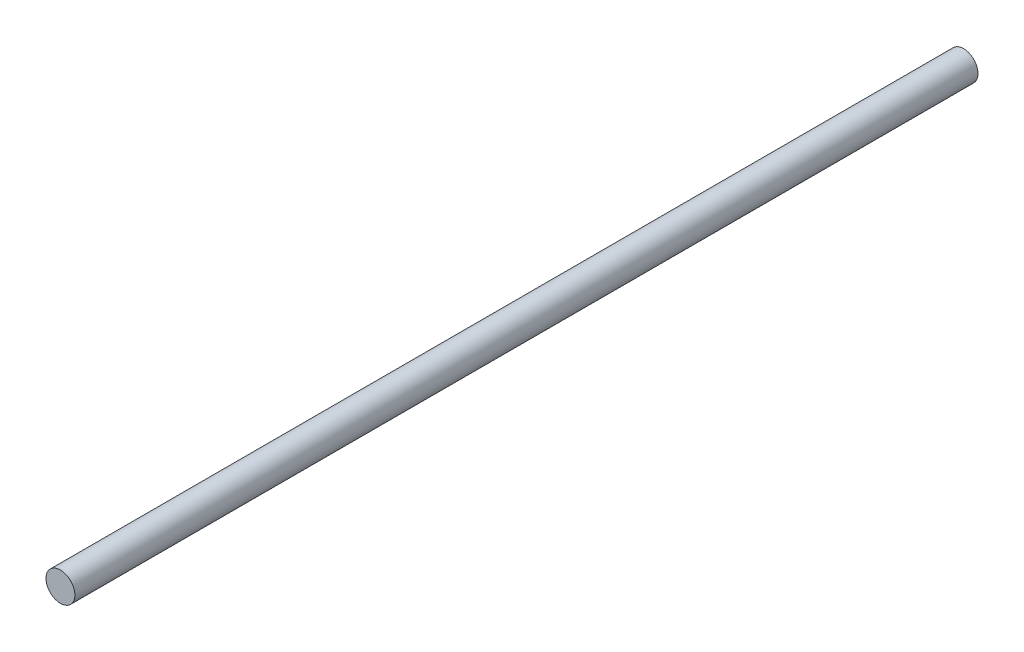
ISO-10303-21;
HEADER;
FILE_DESCRIPTION(('STEP AP214'),'2;1');
FILE_NAME('part.step','',(''),(''),'','','');
FILE_SCHEMA(('AUTOMOTIVE_DESIGN { 1 0 10303 214 1 1 1 1 }'));
ENDSEC;
DATA;
#1=APPLICATION_CONTEXT('core data for automotive mechanical design processes');
#2=APPLICATION_PROTOCOL_DEFINITION('international standard','automotive_design',2000,#1);
#3=PRODUCT_CONTEXT('',#1,'mechanical');
#4=PRODUCT('Part','Part','',(#3));
#5=PRODUCT_RELATED_PRODUCT_CATEGORY('part','',(#4));
#6=PRODUCT_DEFINITION_FORMATION('','',#4);
#7=PRODUCT_DEFINITION_CONTEXT('part definition',#1,'design');
#8=PRODUCT_DEFINITION('design','',#6,#7);
#9=PRODUCT_DEFINITION_SHAPE('','',#8);
#10=(LENGTH_UNIT() NAMED_UNIT(*) SI_UNIT(.MILLI.,.METRE.));
#11=(NAMED_UNIT(*) PLANE_ANGLE_UNIT() SI_UNIT($,.RADIAN.));
#12=(NAMED_UNIT(*) SI_UNIT($,.STERADIAN.) SOLID_ANGLE_UNIT());
#13=UNCERTAINTY_MEASURE_WITH_UNIT(LENGTH_MEASURE(1.E-05),#10,'distance_accuracy_value','');
#14=(GEOMETRIC_REPRESENTATION_CONTEXT(3) GLOBAL_UNCERTAINTY_ASSIGNED_CONTEXT((#13)) GLOBAL_UNIT_ASSIGNED_CONTEXT((#10,
#11,#12)) REPRESENTATION_CONTEXT('',''));
#15=CARTESIAN_POINT('',(0.,0.,0.));
#16=DIRECTION('',(0.,0.,1.));
#17=DIRECTION('',(1.,0.,0.));
#18=AXIS2_PLACEMENT_3D('',#15,#16,#17);
#19=CARTESIAN_POINT('',(0.,0.,-635.));
#20=DIRECTION('',(0.,0.,1.));
#21=DIRECTION('',(1.,0.,0.));
#22=AXIS2_PLACEMENT_3D('',#19,#20,#21);
#23=CYLINDRICAL_SURFACE('',#22,10.16);
#24=CARTESIAN_POINT('',(0.,0.,-635.));
#25=DIRECTION('',(0.,0.,1.));
#26=DIRECTION('',(1.,0.,0.));
#27=AXIS2_PLACEMENT_3D('',#24,#25,#26);
#28=CIRCLE('',#27,10.16);
#29=CARTESIAN_POINT('',(10.16,0.,-635.));
#30=VERTEX_POINT('',#29);
#31=EDGE_CURVE('E10',#30,#30,#28,.T.);
#32=CARTESIAN_POINT('',(0.,0.,0.));
#33=DIRECTION('',(0.,0.,1.));
#34=DIRECTION('',(1.,0.,0.));
#35=AXIS2_PLACEMENT_3D('',#32,#33,#34);
#36=CIRCLE('',#35,10.16);
#37=CARTESIAN_POINT('',(10.16,0.,-1.11022302462516E-13));
#38=VERTEX_POINT('',#37);
#39=EDGE_CURVE('E48',#38,#38,#36,.T.);
#40=CARTESIAN_POINT('',(10.16,0.,-635.));
#41=CARTESIAN_POINT('',(10.16,0.,-628.385416666667));
#42=CARTESIAN_POINT('',(10.16,0.,-621.770833333333));
#43=CARTESIAN_POINT('',(10.16,0.,-608.541666666667));
#44=CARTESIAN_POINT('',(10.16,0.,-601.927083333333));
#45=CARTESIAN_POINT('',(10.16,0.,-588.697916666667));
#46=CARTESIAN_POINT('',(10.16,0.,-582.083333333333));
#47=CARTESIAN_POINT('',(10.16,0.,-568.854166666667));
#48=CARTESIAN_POINT('',(10.16,0.,-562.239583333333));
#49=CARTESIAN_POINT('',(10.16,0.,-549.010416666667));
#50=CARTESIAN_POINT('',(10.16,0.,-542.395833333333));
#51=CARTESIAN_POINT('',(10.16,0.,-529.166666666667));
#52=CARTESIAN_POINT('',(10.16,0.,-522.552083333333));
#53=CARTESIAN_POINT('',(10.16,0.,-509.322916666667));
#54=CARTESIAN_POINT('',(10.16,0.,-502.708333333333));
#55=CARTESIAN_POINT('',(10.16,0.,-489.479166666667));
#56=CARTESIAN_POINT('',(10.16,0.,-482.864583333333));
#57=CARTESIAN_POINT('',(10.16,0.,-469.635416666667));
#58=CARTESIAN_POINT('',(10.16,0.,-463.020833333333));
#59=CARTESIAN_POINT('',(10.16,0.,-449.791666666667));
#60=CARTESIAN_POINT('',(10.16,0.,-443.177083333333));
#61=CARTESIAN_POINT('',(10.16,0.,-429.947916666667));
#62=CARTESIAN_POINT('',(10.16,0.,-423.333333333333));
#63=CARTESIAN_POINT('',(10.16,0.,-410.104166666667));
#64=CARTESIAN_POINT('',(10.16,0.,-403.489583333333));
#65=CARTESIAN_POINT('',(10.16,0.,-390.260416666667));
#66=CARTESIAN_POINT('',(10.16,0.,-383.645833333333));
#67=CARTESIAN_POINT('',(10.16,0.,-370.416666666667));
#68=CARTESIAN_POINT('',(10.16,0.,-363.802083333333));
#69=CARTESIAN_POINT('',(10.16,0.,-350.572916666667));
#70=CARTESIAN_POINT('',(10.16,0.,-343.958333333333));
#71=CARTESIAN_POINT('',(10.16,0.,-330.729166666667));
#72=CARTESIAN_POINT('',(10.16,0.,-324.114583333333));
#73=CARTESIAN_POINT('',(10.16,0.,-310.885416666667));
#74=CARTESIAN_POINT('',(10.16,0.,-304.270833333333));
#75=CARTESIAN_POINT('',(10.16,0.,-291.041666666667));
#76=CARTESIAN_POINT('',(10.16,0.,-284.427083333333));
#77=CARTESIAN_POINT('',(10.16,0.,-271.197916666667));
#78=CARTESIAN_POINT('',(10.16,0.,-264.583333333333));
#79=CARTESIAN_POINT('',(10.16,0.,-251.354166666667));
#80=CARTESIAN_POINT('',(10.16,0.,-244.739583333333));
#81=CARTESIAN_POINT('',(10.16,0.,-231.510416666667));
#82=CARTESIAN_POINT('',(10.16,0.,-224.895833333333));
#83=CARTESIAN_POINT('',(10.16,0.,-211.666666666667));
#84=CARTESIAN_POINT('',(10.16,0.,-205.052083333333));
#85=CARTESIAN_POINT('',(10.16,0.,-191.822916666667));
#86=CARTESIAN_POINT('',(10.16,0.,-185.208333333333));
#87=CARTESIAN_POINT('',(10.16,0.,-171.979166666667));
#88=CARTESIAN_POINT('',(10.16,0.,-165.364583333333));
#89=CARTESIAN_POINT('',(10.16,0.,-152.135416666667));
#90=CARTESIAN_POINT('',(10.16,0.,-145.520833333333));
#91=CARTESIAN_POINT('',(10.16,0.,-132.291666666667));
#92=CARTESIAN_POINT('',(10.16,0.,-125.677083333333));
#93=CARTESIAN_POINT('',(10.16,0.,-112.447916666667));
#94=CARTESIAN_POINT('',(10.16,0.,-105.833333333333));
#95=CARTESIAN_POINT('',(10.16,0.,-92.6041666666668));
#96=CARTESIAN_POINT('',(10.16,0.,-85.9895833333334));
#97=CARTESIAN_POINT('',(10.16,0.,-72.7604166666668));
#98=CARTESIAN_POINT('',(10.16,0.,-66.1458333333335));
#99=CARTESIAN_POINT('',(10.16,0.,-52.9166666666668));
#100=CARTESIAN_POINT('',(10.16,0.,-46.3020833333334));
#101=CARTESIAN_POINT('',(10.16,0.,-33.0729166666668));
#102=CARTESIAN_POINT('',(10.16,0.,-26.4583333333335));
#103=CARTESIAN_POINT('',(10.16,0.,-13.2291666666668));
#104=CARTESIAN_POINT('',(10.16,0.,-6.61458333333346));
#105=CARTESIAN_POINT('',(10.16,0.,-1.11022302462516E-13));
#106=B_SPLINE_CURVE_WITH_KNOTS('',3,(#40,#41,#42,#43,#44,#45,#46,#47,#48,#49,#50,#51,#52,#53,
#54,#55,#56,#57,#58,#59,#60,#61,#62,#63,#64,#65,#66,#67,#68,#69,#70,#71,#72,#73,#74,#75,#76,#77,
#78,#79,#80,#81,#82,#83,#84,#85,#86,#87,#88,#89,#90,#91,#92,#93,#94,#95,#96,#97,#98,#99,#100,
#101,#102,#103,#104,#105),.UNSPECIFIED.,.F.,.F.,(4,2,2,2,2,2,2,2,2,2,2,2,2,2,2,2,2,2,2,2,2,2,2,
2,2,2,2,2,2,2,2,2,4),(0.,19.84375,39.6875000000001,59.53125,79.3750000000001,99.21875,119.0625,
138.90625,158.75,178.59375,198.4375,218.28125,238.125,257.96875,277.8125,297.65625,317.5,
337.34375,357.1875,377.03125,396.875,416.71875,436.5625,456.40625,476.25,496.09375,515.9375,
535.78125,555.625,575.46875,595.3125,615.15625,635.),.UNSPECIFIED.);
#107=EDGE_CURVE('BSEAM45',#30,#38,#106,.T.);
#108=ORIENTED_EDGE('',*,*,#31,.T.);
#109=ORIENTED_EDGE('',*,*,#39,.F.);
#110=ORIENTED_EDGE('',*,*,#107,.T.);
#111=ORIENTED_EDGE('',*,*,#107,.F.);
#112=EDGE_LOOP('',(#108,#110,#109,#111));
#113=FACE_BOUND('',#112,.T.);
#114=ADVANCED_FACE('F45',(#113),#23,.T.);
#115=CARTESIAN_POINT('',(0.,0.,-635.));
#116=DIRECTION('',(0.,0.,1.));
#117=DIRECTION('',(1.,0.,0.));
#118=AXIS2_PLACEMENT_3D('',#115,#116,#117);
#119=PLANE('',#118);
#120=ORIENTED_EDGE('',*,*,#31,.F.);
#121=EDGE_LOOP('',(#120));
#122=FACE_BOUND('',#121,.T.);
#123=ADVANCED_FACE('F64',(#122),#119,.F.);
#124=CARTESIAN_POINT('',(0.,0.,0.));
#125=DIRECTION('',(0.,0.,1.));
#126=DIRECTION('',(1.,0.,0.));
#127=AXIS2_PLACEMENT_3D('',#124,#125,#126);
#128=PLANE('',#127);
#129=ORIENTED_EDGE('',*,*,#39,.T.);
#130=EDGE_LOOP('',(#129));
#131=FACE_BOUND('',#130,.T.);
#132=ADVANCED_FACE('F61',(#131),#128,.T.);
#133=CLOSED_SHELL('',(#114,#123,#132));
#134=MANIFOLD_SOLID_BREP('B2',#133);
#135=ADVANCED_BREP_SHAPE_REPRESENTATION('',(#18,#134),#14);
#136=SHAPE_DEFINITION_REPRESENTATION(#9,#135);
ENDSEC;
END-ISO-10303-21;
